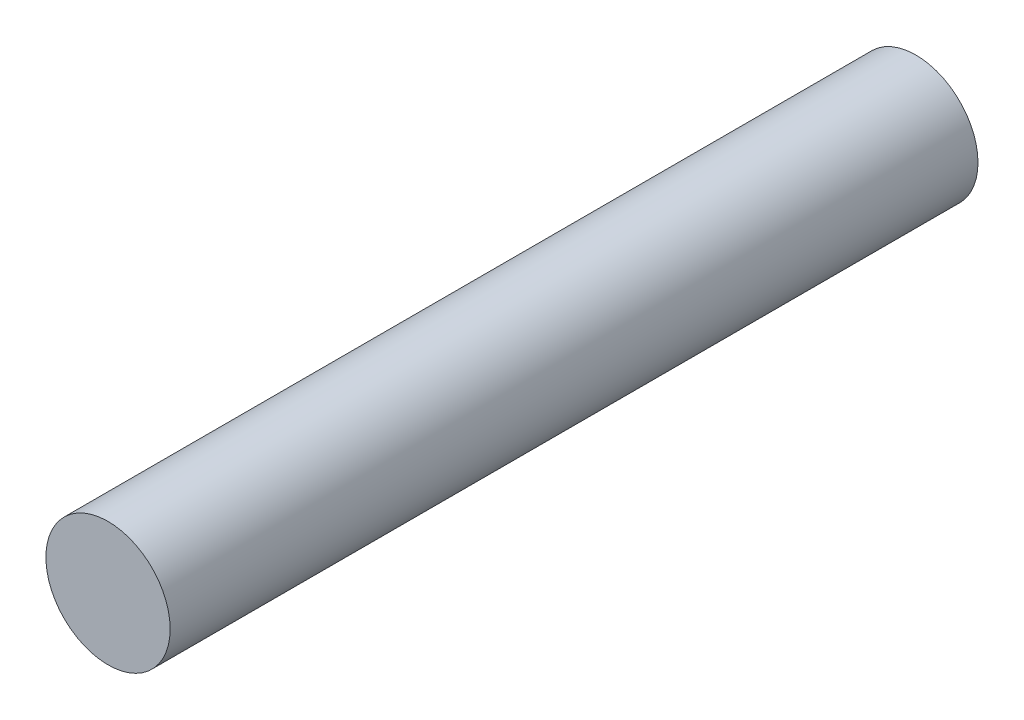
ISO-10303-21;
HEADER;
FILE_DESCRIPTION(('STEP AP214'),'2;1');
FILE_NAME('part.step','',(''),(''),'','','');
FILE_SCHEMA(('AUTOMOTIVE_DESIGN { 1 0 10303 214 1 1 1 1 }'));
ENDSEC;
DATA;
#1=APPLICATION_CONTEXT('core data for automotive mechanical design processes');
#2=APPLICATION_PROTOCOL_DEFINITION('international standard','automotive_design',2000,#1);
#3=PRODUCT_CONTEXT('',#1,'mechanical');
#4=PRODUCT('Part','Part','',(#3));
#5=PRODUCT_RELATED_PRODUCT_CATEGORY('part','',(#4));
#6=PRODUCT_DEFINITION_FORMATION('','',#4);
#7=PRODUCT_DEFINITION_CONTEXT('part definition',#1,'design');
#8=PRODUCT_DEFINITION('design','',#6,#7);
#9=PRODUCT_DEFINITION_SHAPE('','',#8);
#10=(LENGTH_UNIT() NAMED_UNIT(*) SI_UNIT(.MILLI.,.METRE.));
#11=(NAMED_UNIT(*) PLANE_ANGLE_UNIT() SI_UNIT($,.RADIAN.));
#12=(NAMED_UNIT(*) SI_UNIT($,.STERADIAN.) SOLID_ANGLE_UNIT());
#13=UNCERTAINTY_MEASURE_WITH_UNIT(LENGTH_MEASURE(1.E-05),#10,'distance_accuracy_value','');
#14=(GEOMETRIC_REPRESENTATION_CONTEXT(3) GLOBAL_UNCERTAINTY_ASSIGNED_CONTEXT((#13)) GLOBAL_UNIT_ASSIGNED_CONTEXT((#10,
#11,#12)) REPRESENTATION_CONTEXT('',''));
#15=CARTESIAN_POINT('',(0.,0.,0.));
#16=DIRECTION('',(0.,0.,1.));
#17=DIRECTION('',(1.,0.,0.));
#18=AXIS2_PLACEMENT_3D('',#15,#16,#17);
#19=CARTESIAN_POINT('',(-4.94089701956334,5.72290949747983,65.));
#20=DIRECTION('',(0.,0.,-1.));
#21=DIRECTION('',(-1.,0.,0.));
#22=AXIS2_PLACEMENT_3D('',#19,#20,#21);
#23=CYLINDRICAL_SURFACE('',#22,5.);
#24=CARTESIAN_POINT('',(-4.94089701956334,5.72290949747983,65.));
#25=DIRECTION('',(0.,0.,1.));
#26=DIRECTION('',(1.,0.,0.));
#27=AXIS2_PLACEMENT_3D('',#24,#25,#26);
#28=CIRCLE('',#27,5.);
#29=CARTESIAN_POINT('',(0.0591029804366643,5.72290949747983,65.));
#30=VERTEX_POINT('',#29);
#31=EDGE_CURVE('E10',#30,#30,#28,.T.);
#32=ORIENTED_EDGE('',*,*,#31,.F.);
#33=EDGE_LOOP('',(#32));
#34=FACE_BOUND('',#33,.T.);
#35=CARTESIAN_POINT('',(-4.94089701956334,5.72290949747983,0.));
#36=DIRECTION('',(0.,0.,1.));
#37=DIRECTION('',(1.,0.,0.));
#38=AXIS2_PLACEMENT_3D('',#35,#36,#37);
#39=CIRCLE('',#38,5.);
#40=CARTESIAN_POINT('',(0.0591029804366643,5.72290949747983,0.));
#41=VERTEX_POINT('',#40);
#42=EDGE_CURVE('E40',#41,#41,#39,.T.);
#43=ORIENTED_EDGE('',*,*,#42,.T.);
#44=EDGE_LOOP('',(#43));
#45=FACE_BOUND('',#44,.T.);
#46=ADVANCED_FACE('F37',(#34,#45),#23,.T.);
#47=CARTESIAN_POINT('',(-4.94089701956334,5.72290949747983,65.));
#48=DIRECTION('',(0.,0.,1.));
#49=DIRECTION('',(1.,0.,0.));
#50=AXIS2_PLACEMENT_3D('',#47,#48,#49);
#51=PLANE('',#50);
#52=ORIENTED_EDGE('',*,*,#31,.T.);
#53=EDGE_LOOP('',(#52));
#54=FACE_BOUND('',#53,.T.);
#55=ADVANCED_FACE('F54',(#54),#51,.T.);
#56=CARTESIAN_POINT('',(-4.94089701956334,5.72290949747983,0.));
#57=DIRECTION('',(0.,0.,1.));
#58=DIRECTION('',(1.,0.,0.));
#59=AXIS2_PLACEMENT_3D('',#56,#57,#58);
#60=PLANE('',#59);
#61=ORIENTED_EDGE('',*,*,#42,.F.);
#62=EDGE_LOOP('',(#61));
#63=FACE_BOUND('',#62,.T.);
#64=ADVANCED_FACE('F52',(#63),#60,.F.);
#65=CLOSED_SHELL('',(#46,#55,#64));
#66=MANIFOLD_SOLID_BREP('B2',#65);
#67=ADVANCED_BREP_SHAPE_REPRESENTATION('',(#18,#66),#14);
#68=SHAPE_DEFINITION_REPRESENTATION(#9,#67);
ENDSEC;
END-ISO-10303-21;
